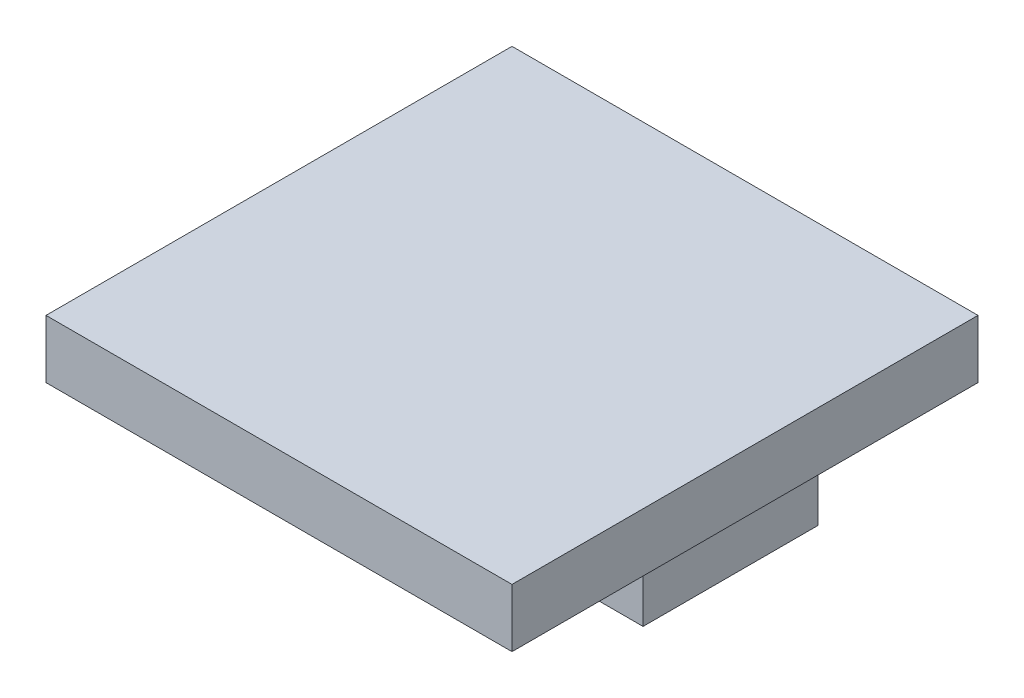
ISO-10303-21;
HEADER;
FILE_DESCRIPTION(('STEP AP214'),'2;1');
FILE_NAME('part.step','',(''),(''),'','','');
FILE_SCHEMA(('AUTOMOTIVE_DESIGN { 1 0 10303 214 1 1 1 1 }'));
ENDSEC;
DATA;
#1=APPLICATION_CONTEXT('core data for automotive mechanical design processes');
#2=APPLICATION_PROTOCOL_DEFINITION('international standard','automotive_design',2000,#1);
#3=PRODUCT_CONTEXT('',#1,'mechanical');
#4=PRODUCT('Part','Part','',(#3));
#5=PRODUCT_RELATED_PRODUCT_CATEGORY('part','',(#4));
#6=PRODUCT_DEFINITION_FORMATION('','',#4);
#7=PRODUCT_DEFINITION_CONTEXT('part definition',#1,'design');
#8=PRODUCT_DEFINITION('design','',#6,#7);
#9=PRODUCT_DEFINITION_SHAPE('','',#8);
#10=(LENGTH_UNIT() NAMED_UNIT(*) SI_UNIT(.MILLI.,.METRE.));
#11=(NAMED_UNIT(*) PLANE_ANGLE_UNIT() SI_UNIT($,.RADIAN.));
#12=(NAMED_UNIT(*) SI_UNIT($,.STERADIAN.) SOLID_ANGLE_UNIT());
#13=UNCERTAINTY_MEASURE_WITH_UNIT(LENGTH_MEASURE(1.E-05),#10,'distance_accuracy_value','');
#14=(GEOMETRIC_REPRESENTATION_CONTEXT(3) GLOBAL_UNCERTAINTY_ASSIGNED_CONTEXT((#13)) GLOBAL_UNIT_ASSIGNED_CONTEXT((#10,
#11,#12)) REPRESENTATION_CONTEXT('',''));
#15=CARTESIAN_POINT('',(0.,0.,0.));
#16=DIRECTION('',(0.,0.,1.));
#17=DIRECTION('',(1.,0.,0.));
#18=AXIS2_PLACEMENT_3D('',#15,#16,#17);
#19=CARTESIAN_POINT('',(-12.5,4.,6.));
#20=DIRECTION('',(1.,0.,0.));
#21=DIRECTION('',(0.,0.,-1.));
#22=AXIS2_PLACEMENT_3D('',#19,#20,#21);
#23=PLANE('',#22);
#24=DIRECTION('',(0.,0.,1.));
#25=VECTOR('',#24,1.);
#26=CARTESIAN_POINT('',(-12.5,0.,6.));
#27=LINE('',#26,#25);
#28=CARTESIAN_POINT('',(-12.5,0.,-6.));
#29=VERTEX_POINT('',#28);
#30=CARTESIAN_POINT('',(-12.5,0.,6.));
#31=VERTEX_POINT('',#30);
#32=EDGE_CURVE('E137',#29,#31,#27,.T.);
#33=ORIENTED_EDGE('',*,*,#32,.T.);
#34=DIRECTION('',(0.,-1.,0.));
#35=VECTOR('',#34,1.);
#36=CARTESIAN_POINT('',(-12.5,4.,6.));
#37=LINE('',#36,#35);
#38=CARTESIAN_POINT('',(-12.5,4.,6.));
#39=VERTEX_POINT('',#38);
#40=EDGE_CURVE('E11',#39,#31,#37,.T.);
#41=ORIENTED_EDGE('',*,*,#40,.F.);
#42=DIRECTION('',(0.,0.,1.));
#43=VECTOR('',#42,1.);
#44=CARTESIAN_POINT('',(-12.5,4.,6.));
#45=LINE('',#44,#43);
#46=CARTESIAN_POINT('',(-12.5,4.,-6.));
#47=VERTEX_POINT('',#46);
#48=EDGE_CURVE('E146',#47,#39,#45,.T.);
#49=ORIENTED_EDGE('',*,*,#48,.F.);
#50=DIRECTION('',(0.,-1.,0.));
#51=VECTOR('',#50,1.);
#52=CARTESIAN_POINT('',(-12.5,4.,-6.));
#53=LINE('',#52,#51);
#54=EDGE_CURVE('E155',#47,#29,#53,.T.);
#55=ORIENTED_EDGE('',*,*,#54,.T.);
#56=EDGE_LOOP('',(#33,#41,#49,#55));
#57=FACE_BOUND('',#56,.T.);
#58=ADVANCED_FACE('F39',(#57),#23,.F.);
#59=CARTESIAN_POINT('',(12.5,4.,6.));
#60=DIRECTION('',(0.,0.,-1.));
#61=DIRECTION('',(-1.,0.,0.));
#62=AXIS2_PLACEMENT_3D('',#59,#60,#61);
#63=PLANE('',#62);
#64=DIRECTION('',(1.,0.,0.));
#65=VECTOR('',#64,1.);
#66=CARTESIAN_POINT('',(12.5,0.,6.));
#67=LINE('',#66,#65);
#68=CARTESIAN_POINT('',(12.5,0.,6.));
#69=VERTEX_POINT('',#68);
#70=EDGE_CURVE('E140',#31,#69,#67,.T.);
#71=ORIENTED_EDGE('',*,*,#70,.T.);
#72=DIRECTION('',(0.,-1.,0.));
#73=VECTOR('',#72,1.);
#74=CARTESIAN_POINT('',(12.5,4.,6.));
#75=LINE('',#74,#73);
#76=CARTESIAN_POINT('',(12.5,4.,6.));
#77=VERTEX_POINT('',#76);
#78=EDGE_CURVE('E47',#77,#69,#75,.T.);
#79=ORIENTED_EDGE('',*,*,#78,.F.);
#80=DIRECTION('',(1.,0.,0.));
#81=VECTOR('',#80,1.);
#82=CARTESIAN_POINT('',(12.5,4.,6.));
#83=LINE('',#82,#81);
#84=EDGE_CURVE('E81',#39,#77,#83,.T.);
#85=ORIENTED_EDGE('',*,*,#84,.F.);
#86=ORIENTED_EDGE('',*,*,#40,.T.);
#87=EDGE_LOOP('',(#71,#79,#85,#86));
#88=FACE_BOUND('',#87,.T.);
#89=ADVANCED_FACE('F181',(#88),#63,.F.);
#90=CARTESIAN_POINT('',(12.5,4.,6.));
#91=DIRECTION('',(-1.,0.,0.));
#92=DIRECTION('',(0.,0.,1.));
#93=AXIS2_PLACEMENT_3D('',#90,#91,#92);
#94=PLANE('',#93);
#95=DIRECTION('',(0.,0.,-1.));
#96=VECTOR('',#95,1.);
#97=CARTESIAN_POINT('',(12.5,0.,6.));
#98=LINE('',#97,#96);
#99=CARTESIAN_POINT('',(12.5,0.,-6.));
#100=VERTEX_POINT('',#99);
#101=EDGE_CURVE('E71',#69,#100,#98,.T.);
#102=ORIENTED_EDGE('',*,*,#101,.T.);
#103=DIRECTION('',(0.,-1.,0.));
#104=VECTOR('',#103,1.);
#105=CARTESIAN_POINT('',(12.5,4.,-6.));
#106=LINE('',#105,#104);
#107=CARTESIAN_POINT('',(12.5,4.,-6.));
#108=VERTEX_POINT('',#107);
#109=EDGE_CURVE('E55',#108,#100,#106,.T.);
#110=ORIENTED_EDGE('',*,*,#109,.F.);
#111=DIRECTION('',(0.,0.,-1.));
#112=VECTOR('',#111,1.);
#113=CARTESIAN_POINT('',(12.5,4.,6.));
#114=LINE('',#113,#112);
#115=EDGE_CURVE('E150',#77,#108,#114,.T.);
#116=ORIENTED_EDGE('',*,*,#115,.F.);
#117=ORIENTED_EDGE('',*,*,#78,.T.);
#118=EDGE_LOOP('',(#102,#110,#116,#117));
#119=FACE_BOUND('',#118,.T.);
#120=ADVANCED_FACE('F161',(#119),#94,.F.);
#121=CARTESIAN_POINT('',(12.5,4.,-6.));
#122=DIRECTION('',(0.,0.,1.));
#123=DIRECTION('',(1.,0.,0.));
#124=AXIS2_PLACEMENT_3D('',#121,#122,#123);
#125=PLANE('',#124);
#126=DIRECTION('',(-1.,0.,0.));
#127=VECTOR('',#126,1.);
#128=CARTESIAN_POINT('',(12.5,0.,-6.));
#129=LINE('',#128,#127);
#130=EDGE_CURVE('E76',#100,#29,#129,.T.);
#131=ORIENTED_EDGE('',*,*,#130,.T.);
#132=ORIENTED_EDGE('',*,*,#54,.F.);
#133=DIRECTION('',(-1.,0.,0.));
#134=VECTOR('',#133,1.);
#135=CARTESIAN_POINT('',(12.5,4.,-6.));
#136=LINE('',#135,#134);
#137=EDGE_CURVE('E153',#108,#47,#136,.T.);
#138=ORIENTED_EDGE('',*,*,#137,.F.);
#139=ORIENTED_EDGE('',*,*,#109,.T.);
#140=EDGE_LOOP('',(#131,#132,#138,#139));
#141=FACE_BOUND('',#140,.T.);
#142=ADVANCED_FACE('F166',(#141),#125,.F.);
#143=CARTESIAN_POINT('',(0.,0.,0.));
#144=DIRECTION('',(0.,1.,0.));
#145=DIRECTION('',(0.,0.,1.));
#146=AXIS2_PLACEMENT_3D('',#143,#144,#145);
#147=PLANE('',#146);
#148=ORIENTED_EDGE('',*,*,#32,.F.);
#149=ORIENTED_EDGE('',*,*,#130,.F.);
#150=ORIENTED_EDGE('',*,*,#101,.F.);
#151=ORIENTED_EDGE('',*,*,#70,.F.);
#152=EDGE_LOOP('',(#148,#149,#150,#151));
#153=FACE_BOUND('',#152,.T.);
#154=ADVANCED_FACE('F164',(#153),#147,.F.);
#155=CARTESIAN_POINT('',(0.,4.,0.));
#156=DIRECTION('',(0.,-1.,0.));
#157=DIRECTION('',(0.,0.,-1.));
#158=AXIS2_PLACEMENT_3D('',#155,#156,#157);
#159=PLANE('',#158);
#160=DIRECTION('',(0.,0.,-1.));
#161=VECTOR('',#160,1.);
#162=CARTESIAN_POINT('',(13.5,4.,-16.));
#163=LINE('',#162,#161);
#164=CARTESIAN_POINT('',(13.5,4.,16.));
#165=VERTEX_POINT('',#164);
#166=CARTESIAN_POINT('',(13.5,4.,-16.));
#167=VERTEX_POINT('',#166);
#168=EDGE_CURVE('E136',#165,#167,#163,.T.);
#169=ORIENTED_EDGE('',*,*,#168,.F.);
#170=DIRECTION('',(1.,0.,0.));
#171=VECTOR('',#170,1.);
#172=CARTESIAN_POINT('',(13.5,4.,16.));
#173=LINE('',#172,#171);
#174=CARTESIAN_POINT('',(-18.5,4.,16.));
#175=VERTEX_POINT('',#174);
#176=EDGE_CURVE('E132',#175,#165,#173,.T.);
#177=ORIENTED_EDGE('',*,*,#176,.F.);
#178=DIRECTION('',(0.,0.,1.));
#179=VECTOR('',#178,1.);
#180=CARTESIAN_POINT('',(-18.5,4.,-16.));
#181=LINE('',#180,#179);
#182=CARTESIAN_POINT('',(-18.5,4.,-16.));
#183=VERTEX_POINT('',#182);
#184=EDGE_CURVE('E208',#183,#175,#181,.T.);
#185=ORIENTED_EDGE('',*,*,#184,.F.);
#186=DIRECTION('',(-1.,0.,0.));
#187=VECTOR('',#186,1.);
#188=CARTESIAN_POINT('',(13.5,4.,-16.));
#189=LINE('',#188,#187);
#190=EDGE_CURVE('E211',#167,#183,#189,.T.);
#191=ORIENTED_EDGE('',*,*,#190,.F.);
#192=EDGE_LOOP('',(#169,#177,#185,#191));
#193=FACE_BOUND('',#192,.T.);
#194=ORIENTED_EDGE('',*,*,#48,.T.);
#195=ORIENTED_EDGE('',*,*,#84,.T.);
#196=ORIENTED_EDGE('',*,*,#115,.T.);
#197=ORIENTED_EDGE('',*,*,#137,.T.);
#198=EDGE_LOOP('',(#194,#195,#196,#197));
#199=FACE_BOUND('',#198,.T.);
#200=ADVANCED_FACE('F168',(#193,#199),#159,.T.);
#201=CARTESIAN_POINT('',(13.5,8.,-16.));
#202=DIRECTION('',(-1.,0.,0.));
#203=DIRECTION('',(0.,0.,1.));
#204=AXIS2_PLACEMENT_3D('',#201,#202,#203);
#205=PLANE('',#204);
#206=ORIENTED_EDGE('',*,*,#168,.T.);
#207=DIRECTION('',(0.,-1.,0.));
#208=VECTOR('',#207,1.);
#209=CARTESIAN_POINT('',(13.5,8.,-16.));
#210=LINE('',#209,#208);
#211=CARTESIAN_POINT('',(13.5,8.,-16.));
#212=VERTEX_POINT('',#211);
#213=EDGE_CURVE('E116',#212,#167,#210,.T.);
#214=ORIENTED_EDGE('',*,*,#213,.F.);
#215=DIRECTION('',(0.,0.,-1.));
#216=VECTOR('',#215,1.);
#217=CARTESIAN_POINT('',(13.5,8.,-16.));
#218=LINE('',#217,#216);
#219=CARTESIAN_POINT('',(13.5,8.,16.));
#220=VERTEX_POINT('',#219);
#221=EDGE_CURVE('E123',#220,#212,#218,.T.);
#222=ORIENTED_EDGE('',*,*,#221,.F.);
#223=DIRECTION('',(0.,-1.,0.));
#224=VECTOR('',#223,1.);
#225=CARTESIAN_POINT('',(13.5,8.,16.));
#226=LINE('',#225,#224);
#227=EDGE_CURVE('E205',#220,#165,#226,.T.);
#228=ORIENTED_EDGE('',*,*,#227,.T.);
#229=EDGE_LOOP('',(#206,#214,#222,#228));
#230=FACE_BOUND('',#229,.T.);
#231=ADVANCED_FACE('F134',(#230),#205,.F.);
#232=CARTESIAN_POINT('',(13.5,8.,-16.));
#233=DIRECTION('',(0.,0.,1.));
#234=DIRECTION('',(1.,0.,0.));
#235=AXIS2_PLACEMENT_3D('',#232,#233,#234);
#236=PLANE('',#235);
#237=ORIENTED_EDGE('',*,*,#190,.T.);
#238=DIRECTION('',(0.,-1.,0.));
#239=VECTOR('',#238,1.);
#240=CARTESIAN_POINT('',(-18.5,8.,-16.));
#241=LINE('',#240,#239);
#242=CARTESIAN_POINT('',(-18.5,8.,-16.));
#243=VERTEX_POINT('',#242);
#244=EDGE_CURVE('E119',#243,#183,#241,.T.);
#245=ORIENTED_EDGE('',*,*,#244,.F.);
#246=DIRECTION('',(-1.,0.,0.));
#247=VECTOR('',#246,1.);
#248=CARTESIAN_POINT('',(13.5,8.,-16.));
#249=LINE('',#248,#247);
#250=EDGE_CURVE('E112',#212,#243,#249,.T.);
#251=ORIENTED_EDGE('',*,*,#250,.F.);
#252=ORIENTED_EDGE('',*,*,#213,.T.);
#253=EDGE_LOOP('',(#237,#245,#251,#252));
#254=FACE_BOUND('',#253,.T.);
#255=ADVANCED_FACE('F114',(#254),#236,.F.);
#256=CARTESIAN_POINT('',(-18.5,8.,-16.));
#257=DIRECTION('',(1.,0.,0.));
#258=DIRECTION('',(0.,0.,-1.));
#259=AXIS2_PLACEMENT_3D('',#256,#257,#258);
#260=PLANE('',#259);
#261=ORIENTED_EDGE('',*,*,#184,.T.);
#262=DIRECTION('',(0.,-1.,0.));
#263=VECTOR('',#262,1.);
#264=CARTESIAN_POINT('',(-18.5,8.,16.));
#265=LINE('',#264,#263);
#266=CARTESIAN_POINT('',(-18.5,8.,16.));
#267=VERTEX_POINT('',#266);
#268=EDGE_CURVE('E142',#267,#175,#265,.T.);
#269=ORIENTED_EDGE('',*,*,#268,.F.);
#270=DIRECTION('',(0.,0.,1.));
#271=VECTOR('',#270,1.);
#272=CARTESIAN_POINT('',(-18.5,8.,-16.));
#273=LINE('',#272,#271);
#274=EDGE_CURVE('E122',#243,#267,#273,.T.);
#275=ORIENTED_EDGE('',*,*,#274,.F.);
#276=ORIENTED_EDGE('',*,*,#244,.T.);
#277=EDGE_LOOP('',(#261,#269,#275,#276));
#278=FACE_BOUND('',#277,.T.);
#279=ADVANCED_FACE('F194',(#278),#260,.F.);
#280=CARTESIAN_POINT('',(13.5,8.,16.));
#281=DIRECTION('',(0.,0.,-1.));
#282=DIRECTION('',(-1.,0.,0.));
#283=AXIS2_PLACEMENT_3D('',#280,#281,#282);
#284=PLANE('',#283);
#285=ORIENTED_EDGE('',*,*,#176,.T.);
#286=ORIENTED_EDGE('',*,*,#227,.F.);
#287=DIRECTION('',(1.,0.,0.));
#288=VECTOR('',#287,1.);
#289=CARTESIAN_POINT('',(13.5,8.,16.));
#290=LINE('',#289,#288);
#291=EDGE_CURVE('E128',#267,#220,#290,.T.);
#292=ORIENTED_EDGE('',*,*,#291,.F.);
#293=ORIENTED_EDGE('',*,*,#268,.T.);
#294=EDGE_LOOP('',(#285,#286,#292,#293));
#295=FACE_BOUND('',#294,.T.);
#296=ADVANCED_FACE('F196',(#295),#284,.F.);
#297=CARTESIAN_POINT('',(0.,8.,0.));
#298=DIRECTION('',(0.,-1.,0.));
#299=DIRECTION('',(0.,0.,-1.));
#300=AXIS2_PLACEMENT_3D('',#297,#298,#299);
#301=PLANE('',#300);
#302=ORIENTED_EDGE('',*,*,#221,.T.);
#303=ORIENTED_EDGE('',*,*,#250,.T.);
#304=ORIENTED_EDGE('',*,*,#274,.T.);
#305=ORIENTED_EDGE('',*,*,#291,.T.);
#306=EDGE_LOOP('',(#302,#303,#304,#305));
#307=FACE_BOUND('',#306,.T.);
#308=ADVANCED_FACE('F126',(#307),#301,.F.);
#309=CLOSED_SHELL('',(#58,#89,#120,#142,#154,#200,#231,#255,#279,#296,#308));
#310=MANIFOLD_SOLID_BREP('B2',#309);
#311=ADVANCED_BREP_SHAPE_REPRESENTATION('',(#18,#310),#14);
#312=SHAPE_DEFINITION_REPRESENTATION(#9,#311);
ENDSEC;
END-ISO-10303-21;
